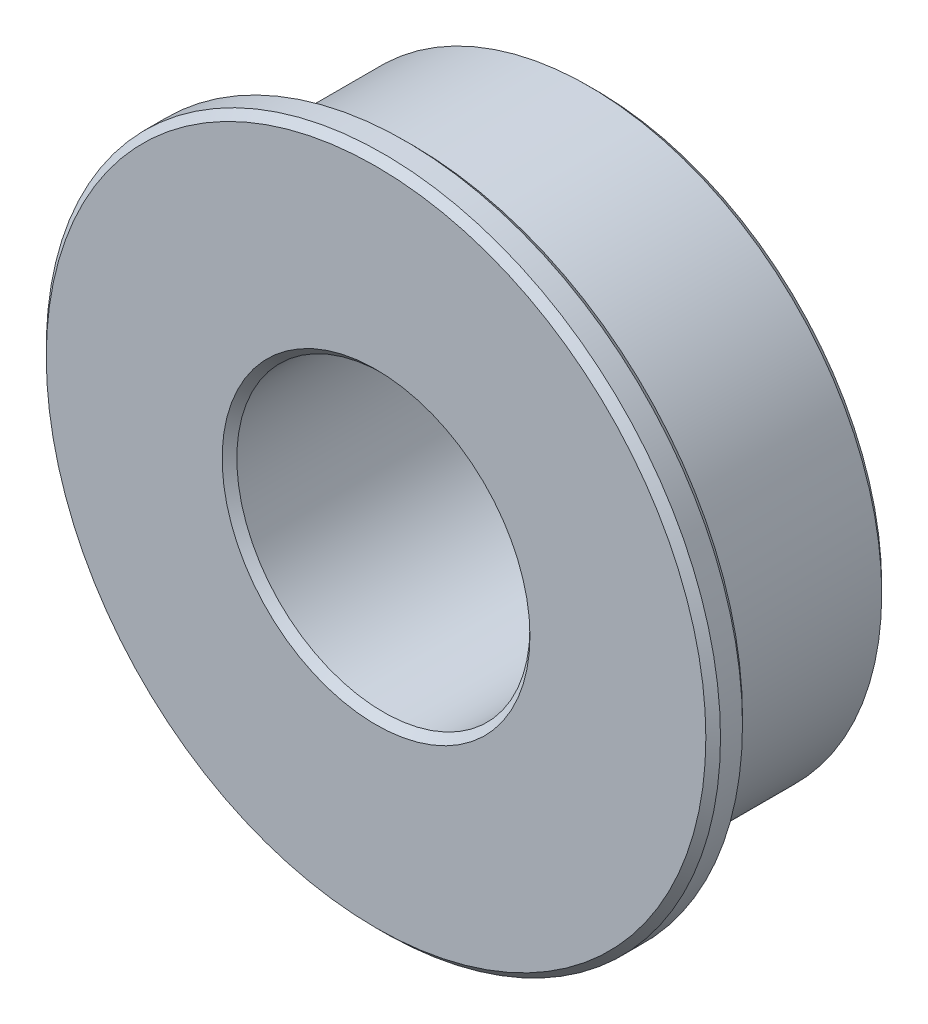
ISO-10303-21;
HEADER;
FILE_DESCRIPTION(('STEP AP214'),'2;1');
FILE_NAME('part.step','',(''),(''),'','','');
FILE_SCHEMA(('AUTOMOTIVE_DESIGN { 1 0 10303 214 1 1 1 1 }'));
ENDSEC;
DATA;
#1=APPLICATION_CONTEXT('core data for automotive mechanical design processes');
#2=APPLICATION_PROTOCOL_DEFINITION('international standard','automotive_design',2000,#1);
#3=PRODUCT_CONTEXT('',#1,'mechanical');
#4=PRODUCT('Part','Part','',(#3));
#5=PRODUCT_RELATED_PRODUCT_CATEGORY('part','',(#4));
#6=PRODUCT_DEFINITION_FORMATION('','',#4);
#7=PRODUCT_DEFINITION_CONTEXT('part definition',#1,'design');
#8=PRODUCT_DEFINITION('design','',#6,#7);
#9=PRODUCT_DEFINITION_SHAPE('','',#8);
#10=(LENGTH_UNIT() NAMED_UNIT(*) SI_UNIT(.MILLI.,.METRE.));
#11=(NAMED_UNIT(*) PLANE_ANGLE_UNIT() SI_UNIT($,.RADIAN.));
#12=(NAMED_UNIT(*) SI_UNIT($,.STERADIAN.) SOLID_ANGLE_UNIT());
#13=UNCERTAINTY_MEASURE_WITH_UNIT(LENGTH_MEASURE(1.E-05),#10,'distance_accuracy_value','');
#14=(GEOMETRIC_REPRESENTATION_CONTEXT(3) GLOBAL_UNCERTAINTY_ASSIGNED_CONTEXT((#13)) GLOBAL_UNIT_ASSIGNED_CONTEXT((#10,
#11,#12)) REPRESENTATION_CONTEXT('',''));
#15=CARTESIAN_POINT('',(0.,0.,0.));
#16=DIRECTION('',(0.,0.,1.));
#17=DIRECTION('',(1.,0.,0.));
#18=AXIS2_PLACEMENT_3D('',#15,#16,#17);
#19=CARTESIAN_POINT('',(0.,0.,3.));
#20=DIRECTION('',(0.,0.,-1.));
#21=DIRECTION('',(-1.,0.,0.));
#22=AXIS2_PLACEMENT_3D('',#19,#20,#21);
#23=CYLINDRICAL_SURFACE('',#22,4.);
#24=CARTESIAN_POINT('',(0.,0.,0.0999999999999985));
#25=DIRECTION('',(0.,0.,1.));
#26=DIRECTION('',(1.,0.,0.));
#27=AXIS2_PLACEMENT_3D('',#24,#25,#26);
#28=CIRCLE('',#27,4.);
#29=CARTESIAN_POINT('',(4.,0.,0.0999999999999985));
#30=VERTEX_POINT('',#29);
#31=EDGE_CURVE('E10',#30,#30,#28,.T.);
#32=ORIENTED_EDGE('',*,*,#31,.T.);
#33=EDGE_LOOP('',(#32));
#34=FACE_BOUND('',#33,.T.);
#35=CARTESIAN_POINT('',(0.,0.,2.5));
#36=DIRECTION('',(0.,0.,1.));
#37=DIRECTION('',(1.,0.,0.));
#38=AXIS2_PLACEMENT_3D('',#35,#36,#37);
#39=CIRCLE('',#38,4.);
#40=CARTESIAN_POINT('',(4.,0.,2.5));
#41=VERTEX_POINT('',#40);
#42=EDGE_CURVE('E78',#41,#41,#39,.T.);
#43=ORIENTED_EDGE('',*,*,#42,.F.);
#44=EDGE_LOOP('',(#43));
#45=FACE_BOUND('',#44,.T.);
#46=ADVANCED_FACE('F39',(#34,#45),#23,.T.);
#47=CARTESIAN_POINT('',(0.,0.,3.));
#48=DIRECTION('',(0.,0.,1.));
#49=DIRECTION('',(1.,0.,0.));
#50=AXIS2_PLACEMENT_3D('',#47,#48,#49);
#51=PLANE('',#50);
#52=CARTESIAN_POINT('',(0.,0.,3.));
#53=DIRECTION('',(0.,0.,1.));
#54=DIRECTION('',(1.,0.,0.));
#55=AXIS2_PLACEMENT_3D('',#52,#53,#54);
#56=CIRCLE('',#55,4.5);
#57=CARTESIAN_POINT('',(4.5,0.,3.));
#58=VERTEX_POINT('',#57);
#59=EDGE_CURVE('E72',#58,#58,#56,.T.);
#60=ORIENTED_EDGE('',*,*,#59,.T.);
#61=EDGE_LOOP('',(#60));
#62=FACE_BOUND('',#61,.T.);
#63=CARTESIAN_POINT('',(0.,0.,3.));
#64=DIRECTION('',(0.,0.,1.));
#65=DIRECTION('',(1.,0.,0.));
#66=AXIS2_PLACEMENT_3D('',#63,#64,#65);
#67=CIRCLE('',#66,2.1);
#68=CARTESIAN_POINT('',(2.1,0.,3.));
#69=VERTEX_POINT('',#68);
#70=EDGE_CURVE('E75',#69,#69,#67,.F.);
#71=ORIENTED_EDGE('',*,*,#70,.T.);
#72=EDGE_LOOP('',(#71));
#73=FACE_BOUND('',#72,.T.);
#74=ADVANCED_FACE('F85',(#62,#73),#51,.T.);
#75=CARTESIAN_POINT('',(0.,0.,0.));
#76=DIRECTION('',(0.,0.,1.));
#77=DIRECTION('',(1.,0.,0.));
#78=AXIS2_PLACEMENT_3D('',#75,#76,#77);
#79=PLANE('',#78);
#80=CARTESIAN_POINT('',(0.,0.,0.));
#81=DIRECTION('',(0.,0.,1.));
#82=DIRECTION('',(1.,0.,0.));
#83=AXIS2_PLACEMENT_3D('',#80,#81,#82);
#84=CIRCLE('',#83,2.1);
#85=CARTESIAN_POINT('',(2.1,0.,0.));
#86=VERTEX_POINT('',#85);
#87=EDGE_CURVE('E55',#86,#86,#84,.T.);
#88=ORIENTED_EDGE('',*,*,#87,.T.);
#89=EDGE_LOOP('',(#88));
#90=FACE_BOUND('',#89,.T.);
#91=CARTESIAN_POINT('',(0.,0.,0.));
#92=DIRECTION('',(0.,0.,1.));
#93=DIRECTION('',(1.,0.,0.));
#94=AXIS2_PLACEMENT_3D('',#91,#92,#93);
#95=CIRCLE('',#94,3.9);
#96=CARTESIAN_POINT('',(3.9,0.,0.));
#97=VERTEX_POINT('',#96);
#98=EDGE_CURVE('E60',#97,#97,#95,.F.);
#99=ORIENTED_EDGE('',*,*,#98,.T.);
#100=EDGE_LOOP('',(#99));
#101=FACE_BOUND('',#100,.T.);
#102=ADVANCED_FACE('F90',(#90,#101),#79,.F.);
#103=CARTESIAN_POINT('',(0.,0.,3.));
#104=DIRECTION('',(0.,0.,-1.));
#105=DIRECTION('',(-1.,0.,0.));
#106=AXIS2_PLACEMENT_3D('',#103,#104,#105);
#107=CYLINDRICAL_SURFACE('',#106,2.);
#108=CARTESIAN_POINT('',(0.,0.,0.0999999999999994));
#109=DIRECTION('',(0.,0.,1.));
#110=DIRECTION('',(1.,0.,0.));
#111=AXIS2_PLACEMENT_3D('',#108,#109,#110);
#112=CIRCLE('',#111,2.);
#113=CARTESIAN_POINT('',(2.,0.,0.0999999999999994));
#114=VERTEX_POINT('',#113);
#115=EDGE_CURVE('E47',#114,#114,#112,.F.);
#116=ORIENTED_EDGE('',*,*,#115,.T.);
#117=EDGE_LOOP('',(#116));
#118=FACE_BOUND('',#117,.T.);
#119=CARTESIAN_POINT('',(0.,0.,2.9));
#120=DIRECTION('',(0.,0.,1.));
#121=DIRECTION('',(1.,0.,0.));
#122=AXIS2_PLACEMENT_3D('',#119,#120,#121);
#123=CIRCLE('',#122,2.);
#124=CARTESIAN_POINT('',(2.,0.,2.9));
#125=VERTEX_POINT('',#124);
#126=EDGE_CURVE('E51',#125,#125,#123,.T.);
#127=ORIENTED_EDGE('',*,*,#126,.T.);
#128=EDGE_LOOP('',(#127));
#129=FACE_BOUND('',#128,.T.);
#130=ADVANCED_FACE('F129',(#118,#129),#107,.F.);
#131=CARTESIAN_POINT('',(0.,0.,2.5));
#132=DIRECTION('',(0.,0.,1.));
#133=DIRECTION('',(1.,0.,0.));
#134=AXIS2_PLACEMENT_3D('',#131,#132,#133);
#135=CYLINDRICAL_SURFACE('',#134,4.6);
#136=CARTESIAN_POINT('',(0.,0.,2.9));
#137=DIRECTION('',(0.,0.,1.));
#138=DIRECTION('',(1.,0.,0.));
#139=AXIS2_PLACEMENT_3D('',#136,#137,#138);
#140=CIRCLE('',#139,4.6);
#141=CARTESIAN_POINT('',(4.6,0.,2.9));
#142=VERTEX_POINT('',#141);
#143=EDGE_CURVE('E66',#142,#142,#140,.F.);
#144=ORIENTED_EDGE('',*,*,#143,.T.);
#145=EDGE_LOOP('',(#144));
#146=FACE_BOUND('',#145,.T.);
#147=CARTESIAN_POINT('',(0.,0.,2.6));
#148=DIRECTION('',(0.,0.,1.));
#149=DIRECTION('',(1.,0.,0.));
#150=AXIS2_PLACEMENT_3D('',#147,#148,#149);
#151=CIRCLE('',#150,4.6);
#152=CARTESIAN_POINT('',(4.6,0.,2.6));
#153=VERTEX_POINT('',#152);
#154=EDGE_CURVE('E69',#153,#153,#151,.T.);
#155=ORIENTED_EDGE('',*,*,#154,.T.);
#156=EDGE_LOOP('',(#155));
#157=FACE_BOUND('',#156,.T.);
#158=ADVANCED_FACE('F131',(#146,#157),#135,.T.);
#159=CARTESIAN_POINT('',(0.,0.,2.5));
#160=DIRECTION('',(0.,0.,1.));
#161=DIRECTION('',(1.,0.,0.));
#162=AXIS2_PLACEMENT_3D('',#159,#160,#161);
#163=PLANE('',#162);
#164=CARTESIAN_POINT('',(0.,0.,2.5));
#165=DIRECTION('',(0.,0.,1.));
#166=DIRECTION('',(1.,0.,0.));
#167=AXIS2_PLACEMENT_3D('',#164,#165,#166);
#168=CIRCLE('',#167,4.5);
#169=CARTESIAN_POINT('',(4.5,0.,2.5));
#170=VERTEX_POINT('',#169);
#171=EDGE_CURVE('E63',#170,#170,#168,.F.);
#172=ORIENTED_EDGE('',*,*,#171,.T.);
#173=EDGE_LOOP('',(#172));
#174=FACE_BOUND('',#173,.T.);
#175=ORIENTED_EDGE('',*,*,#42,.T.);
#176=EDGE_LOOP('',(#175));
#177=FACE_BOUND('',#176,.T.);
#178=ADVANCED_FACE('F82',(#174,#177),#163,.F.);
#179=CARTESIAN_POINT('',(0.,0.,3.));
#180=DIRECTION('',(0.,0.,-1.));
#181=DIRECTION('',(-1.,0.,0.));
#182=AXIS2_PLACEMENT_3D('',#179,#180,#181);
#183=CONICAL_SURFACE('',#182,4.5,0.785398163397448);
#184=ORIENTED_EDGE('',*,*,#143,.F.);
#185=EDGE_LOOP('',(#184));
#186=FACE_BOUND('',#185,.T.);
#187=ORIENTED_EDGE('',*,*,#59,.F.);
#188=EDGE_LOOP('',(#187));
#189=FACE_BOUND('',#188,.T.);
#190=ADVANCED_FACE('F96',(#186,#189),#183,.T.);
#191=CARTESIAN_POINT('',(0.,0.,2.6));
#192=DIRECTION('',(0.,0.,1.));
#193=DIRECTION('',(1.,0.,0.));
#194=AXIS2_PLACEMENT_3D('',#191,#192,#193);
#195=CONICAL_SURFACE('',#194,4.6,0.785398163397448);
#196=ORIENTED_EDGE('',*,*,#171,.F.);
#197=EDGE_LOOP('',(#196));
#198=FACE_BOUND('',#197,.T.);
#199=ORIENTED_EDGE('',*,*,#154,.F.);
#200=EDGE_LOOP('',(#199));
#201=FACE_BOUND('',#200,.T.);
#202=ADVANCED_FACE('F102',(#198,#201),#195,.T.);
#203=CARTESIAN_POINT('',(0.,0.,0.));
#204=DIRECTION('',(0.,0.,-1.));
#205=DIRECTION('',(-1.,0.,0.));
#206=AXIS2_PLACEMENT_3D('',#203,#204,#205);
#207=CONICAL_SURFACE('',#206,2.1,0.785398163397448);
#208=ORIENTED_EDGE('',*,*,#115,.F.);
#209=EDGE_LOOP('',(#208));
#210=FACE_BOUND('',#209,.T.);
#211=ORIENTED_EDGE('',*,*,#87,.F.);
#212=EDGE_LOOP('',(#211));
#213=FACE_BOUND('',#212,.T.);
#214=ADVANCED_FACE('F109',(#210,#213),#207,.F.);
#215=CARTESIAN_POINT('',(0.,0.,2.9));
#216=DIRECTION('',(0.,0.,1.));
#217=DIRECTION('',(1.,0.,0.));
#218=AXIS2_PLACEMENT_3D('',#215,#216,#217);
#219=CONICAL_SURFACE('',#218,2.,0.785398163397455);
#220=ORIENTED_EDGE('',*,*,#70,.F.);
#221=EDGE_LOOP('',(#220));
#222=FACE_BOUND('',#221,.T.);
#223=ORIENTED_EDGE('',*,*,#126,.F.);
#224=EDGE_LOOP('',(#223));
#225=FACE_BOUND('',#224,.T.);
#226=ADVANCED_FACE('F115',(#222,#225),#219,.F.);
#227=CARTESIAN_POINT('',(0.,0.,0.0999999999999985));
#228=DIRECTION('',(0.,0.,1.));
#229=DIRECTION('',(1.,0.,0.));
#230=AXIS2_PLACEMENT_3D('',#227,#228,#229);
#231=CONICAL_SURFACE('',#230,4.,0.785398163397448);
#232=ORIENTED_EDGE('',*,*,#98,.F.);
#233=EDGE_LOOP('',(#232));
#234=FACE_BOUND('',#233,.T.);
#235=ORIENTED_EDGE('',*,*,#31,.F.);
#236=EDGE_LOOP('',(#235));
#237=FACE_BOUND('',#236,.T.);
#238=ADVANCED_FACE('F42',(#234,#237),#231,.T.);
#239=CLOSED_SHELL('',(#46,#74,#102,#130,#158,#178,#190,#202,#214,#226,#238));
#240=MANIFOLD_SOLID_BREP('B2',#239);
#241=ADVANCED_BREP_SHAPE_REPRESENTATION('',(#18,#240),#14);
#242=SHAPE_DEFINITION_REPRESENTATION(#9,#241);
ENDSEC;
END-ISO-10303-21;
